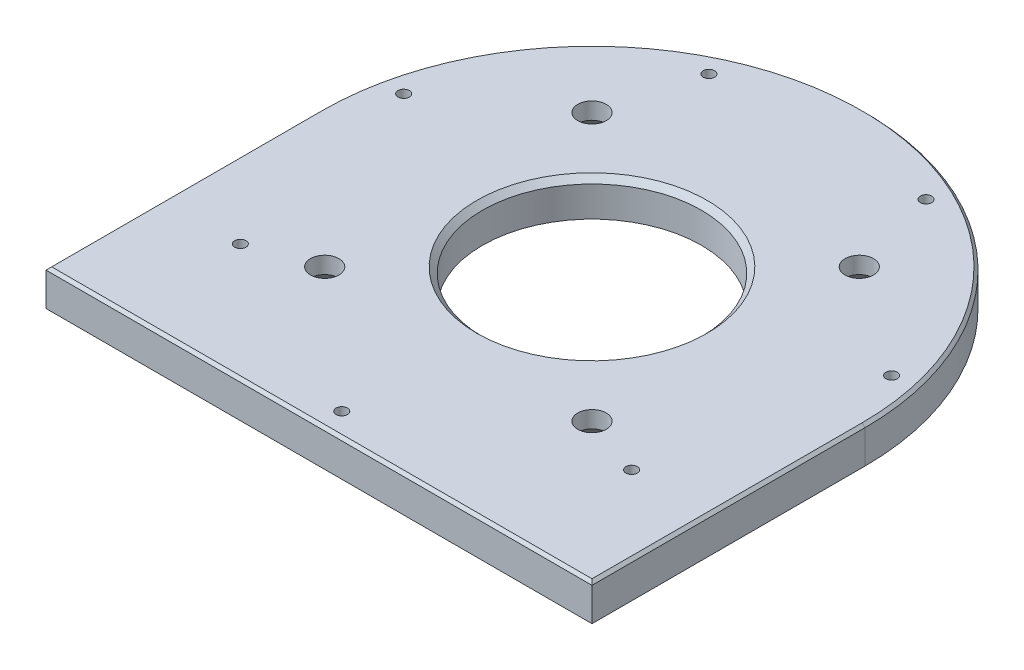
ISO-10303-21;
HEADER;
FILE_DESCRIPTION(('STEP AP214'),'2;1');
FILE_NAME('part.step','',(''),(''),'','','');
FILE_SCHEMA(('AUTOMOTIVE_DESIGN { 1 0 10303 214 1 1 1 1 }'));
ENDSEC;
DATA;
#1=APPLICATION_CONTEXT('core data for automotive mechanical design processes');
#2=APPLICATION_PROTOCOL_DEFINITION('international standard','automotive_design',2000,#1);
#3=PRODUCT_CONTEXT('',#1,'mechanical');
#4=PRODUCT('Part','Part','',(#3));
#5=PRODUCT_RELATED_PRODUCT_CATEGORY('part','',(#4));
#6=PRODUCT_DEFINITION_FORMATION('','',#4);
#7=PRODUCT_DEFINITION_CONTEXT('part definition',#1,'design');
#8=PRODUCT_DEFINITION('design','',#6,#7);
#9=PRODUCT_DEFINITION_SHAPE('','',#8);
#10=(LENGTH_UNIT() NAMED_UNIT(*) SI_UNIT(.MILLI.,.METRE.));
#11=(NAMED_UNIT(*) PLANE_ANGLE_UNIT() SI_UNIT($,.RADIAN.));
#12=(NAMED_UNIT(*) SI_UNIT($,.STERADIAN.) SOLID_ANGLE_UNIT());
#13=UNCERTAINTY_MEASURE_WITH_UNIT(LENGTH_MEASURE(1.E-05),#10,'distance_accuracy_value','');
#14=(GEOMETRIC_REPRESENTATION_CONTEXT(3) GLOBAL_UNCERTAINTY_ASSIGNED_CONTEXT((#13)) GLOBAL_UNIT_ASSIGNED_CONTEXT((#10,
#11,#12)) REPRESENTATION_CONTEXT('',''));
#15=CARTESIAN_POINT('',(0.,0.,0.));
#16=DIRECTION('',(0.,0.,1.));
#17=DIRECTION('',(1.,0.,0.));
#18=AXIS2_PLACEMENT_3D('',#15,#16,#17);
#19=CARTESIAN_POINT('',(-48.,6.35,0.));
#20=DIRECTION('',(1.,0.,0.));
#21=DIRECTION('',(0.,0.,-1.));
#22=AXIS2_PLACEMENT_3D('',#19,#20,#21);
#23=PLANE('',#22);
#24=DIRECTION('',(0.,-1.,0.));
#25=VECTOR('',#24,1.);
#26=CARTESIAN_POINT('',(-48.,6.35,48.));
#27=LINE('',#26,#25);
#28=CARTESIAN_POINT('',(-48.,5.85,48.));
#29=VERTEX_POINT('',#28);
#30=CARTESIAN_POINT('',(-48.,0.,48.));
#31=VERTEX_POINT('',#30);
#32=EDGE_CURVE('E124',#29,#31,#27,.T.);
#33=ORIENTED_EDGE('',*,*,#32,.F.);
#34=DIRECTION('',(0.,0.,-1.));
#35=VECTOR('',#34,1.);
#36=CARTESIAN_POINT('',(-48.,5.85,0.));
#37=LINE('',#36,#35);
#38=CARTESIAN_POINT('',(-48.,5.85,0.));
#39=VERTEX_POINT('',#38);
#40=EDGE_CURVE('E137',#29,#39,#37,.T.);
#41=ORIENTED_EDGE('',*,*,#40,.T.);
#42=DIRECTION('',(0.,-1.,0.));
#43=VECTOR('',#42,1.);
#44=CARTESIAN_POINT('',(-48.,6.35,0.));
#45=LINE('',#44,#43);
#46=CARTESIAN_POINT('',(-48.,0.,0.));
#47=VERTEX_POINT('',#46);
#48=EDGE_CURVE('E126',#39,#47,#45,.T.);
#49=ORIENTED_EDGE('',*,*,#48,.T.);
#50=DIRECTION('',(0.,0.,1.));
#51=VECTOR('',#50,1.);
#52=CARTESIAN_POINT('',(-48.,0.,0.));
#53=LINE('',#52,#51);
#54=EDGE_CURVE('E113',#47,#31,#53,.T.);
#55=ORIENTED_EDGE('',*,*,#54,.T.);
#56=EDGE_LOOP('',(#33,#41,#49,#55));
#57=FACE_BOUND('',#56,.T.);
#58=ADVANCED_FACE('F41',(#57),#23,.F.);
#59=CARTESIAN_POINT('',(-48.,6.35,48.));
#60=DIRECTION('',(0.,0.,-1.));
#61=DIRECTION('',(-1.,0.,0.));
#62=AXIS2_PLACEMENT_3D('',#59,#60,#61);
#63=PLANE('',#62);
#64=DIRECTION('',(0.,-1.,0.));
#65=VECTOR('',#64,1.);
#66=CARTESIAN_POINT('',(48.,6.35,48.));
#67=LINE('',#66,#65);
#68=CARTESIAN_POINT('',(48.,5.85,48.));
#69=VERTEX_POINT('',#68);
#70=CARTESIAN_POINT('',(48.,0.,48.));
#71=VERTEX_POINT('',#70);
#72=EDGE_CURVE('E100',#69,#71,#67,.T.);
#73=ORIENTED_EDGE('',*,*,#72,.F.);
#74=DIRECTION('',(-1.,0.,0.));
#75=VECTOR('',#74,1.);
#76=CARTESIAN_POINT('',(-48.,5.85,48.));
#77=LINE('',#76,#75);
#78=EDGE_CURVE('E142',#69,#29,#77,.T.);
#79=ORIENTED_EDGE('',*,*,#78,.T.);
#80=ORIENTED_EDGE('',*,*,#32,.T.);
#81=DIRECTION('',(1.,0.,0.));
#82=VECTOR('',#81,1.);
#83=CARTESIAN_POINT('',(-48.,0.,48.));
#84=LINE('',#83,#82);
#85=EDGE_CURVE('E108',#31,#71,#84,.T.);
#86=ORIENTED_EDGE('',*,*,#85,.T.);
#87=EDGE_LOOP('',(#73,#79,#80,#86));
#88=FACE_BOUND('',#87,.T.);
#89=ADVANCED_FACE('F292',(#88),#63,.F.);
#90=CARTESIAN_POINT('',(48.,6.35,48.));
#91=DIRECTION('',(-1.,0.,0.));
#92=DIRECTION('',(0.,0.,1.));
#93=AXIS2_PLACEMENT_3D('',#90,#91,#92);
#94=PLANE('',#93);
#95=DIRECTION('',(0.,-1.,0.));
#96=VECTOR('',#95,1.);
#97=CARTESIAN_POINT('',(48.,6.35,0.));
#98=LINE('',#97,#96);
#99=CARTESIAN_POINT('',(48.,5.85,0.));
#100=VERTEX_POINT('',#99);
#101=CARTESIAN_POINT('',(48.,0.,0.));
#102=VERTEX_POINT('',#101);
#103=EDGE_CURVE('E94',#100,#102,#98,.T.);
#104=ORIENTED_EDGE('',*,*,#103,.F.);
#105=DIRECTION('',(0.,0.,1.));
#106=VECTOR('',#105,1.);
#107=CARTESIAN_POINT('',(48.,5.85,48.));
#108=LINE('',#107,#106);
#109=EDGE_CURVE('E57',#100,#69,#108,.T.);
#110=ORIENTED_EDGE('',*,*,#109,.T.);
#111=ORIENTED_EDGE('',*,*,#72,.T.);
#112=DIRECTION('',(0.,0.,-1.));
#113=VECTOR('',#112,1.);
#114=CARTESIAN_POINT('',(48.,0.,48.));
#115=LINE('',#114,#113);
#116=EDGE_CURVE('E101',#71,#102,#115,.T.);
#117=ORIENTED_EDGE('',*,*,#116,.T.);
#118=EDGE_LOOP('',(#104,#110,#111,#117));
#119=FACE_BOUND('',#118,.T.);
#120=ADVANCED_FACE('F104',(#119),#94,.F.);
#121=CARTESIAN_POINT('',(0.,6.35,0.));
#122=DIRECTION('',(0.,1.,0.));
#123=DIRECTION('',(0.,0.,1.));
#124=AXIS2_PLACEMENT_3D('',#121,#122,#123);
#125=PLANE('',#124);
#126=CARTESIAN_POINT('',(0.,6.35,0.));
#127=DIRECTION('',(0.,1.,0.));
#128=DIRECTION('',(0.,0.,1.));
#129=AXIS2_PLACEMENT_3D('',#126,#127,#128);
#130=CIRCLE('',#129,20.25);
#131=CARTESIAN_POINT('',(0.,6.35,20.25));
#132=VERTEX_POINT('',#131);
#133=EDGE_CURVE('E158',#132,#132,#130,.F.);
#134=ORIENTED_EDGE('',*,*,#133,.T.);
#135=EDGE_LOOP('',(#134));
#136=FACE_BOUND('',#135,.T.);
#137=CARTESIAN_POINT('',(0.,6.35,0.));
#138=DIRECTION('',(0.,1.,0.));
#139=DIRECTION('',(0.,0.,1.));
#140=AXIS2_PLACEMENT_3D('',#137,#138,#139);
#141=CIRCLE('',#140,47.5);
#142=CARTESIAN_POINT('',(47.5,6.35,0.));
#143=VERTEX_POINT('',#142);
#144=CARTESIAN_POINT('',(-47.5,6.35,0.));
#145=VERTEX_POINT('',#144);
#146=EDGE_CURVE('E132',#143,#145,#141,.T.);
#147=ORIENTED_EDGE('',*,*,#146,.T.);
#148=DIRECTION('',(0.,0.,1.));
#149=VECTOR('',#148,1.);
#150=CARTESIAN_POINT('',(-47.5,6.35,48.));
#151=LINE('',#150,#149);
#152=CARTESIAN_POINT('',(-47.5,6.35,47.5));
#153=VERTEX_POINT('',#152);
#154=EDGE_CURVE('E134',#145,#153,#151,.T.);
#155=ORIENTED_EDGE('',*,*,#154,.T.);
#156=DIRECTION('',(1.,0.,0.));
#157=VECTOR('',#156,1.);
#158=CARTESIAN_POINT('',(48.,6.35,47.5));
#159=LINE('',#158,#157);
#160=CARTESIAN_POINT('',(47.5,6.35,47.5));
#161=VERTEX_POINT('',#160);
#162=EDGE_CURVE('E128',#153,#161,#159,.T.);
#163=ORIENTED_EDGE('',*,*,#162,.T.);
#164=DIRECTION('',(0.,0.,-1.));
#165=VECTOR('',#164,1.);
#166=CARTESIAN_POINT('',(47.5,6.35,0.));
#167=LINE('',#166,#165);
#168=EDGE_CURVE('E130',#161,#143,#167,.T.);
#169=ORIENTED_EDGE('',*,*,#168,.T.);
#170=EDGE_LOOP('',(#147,#155,#163,#169));
#171=FACE_BOUND('',#170,.T.);
#172=CARTESIAN_POINT('',(-23.5,6.35,23.5));
#173=DIRECTION('',(0.,1.,0.));
#174=DIRECTION('',(0.,0.,1.));
#175=AXIS2_PLACEMENT_3D('',#172,#173,#174);
#176=CIRCLE('',#175,2.49999999999999);
#177=CARTESIAN_POINT('',(-23.5,6.35,26.));
#178=VERTEX_POINT('',#177);
#179=EDGE_CURVE('E221',#178,#178,#176,.T.);
#180=ORIENTED_EDGE('',*,*,#179,.F.);
#181=EDGE_LOOP('',(#180));
#182=FACE_BOUND('',#181,.T.);
#183=CARTESIAN_POINT('',(0.,6.35,44.));
#184=DIRECTION('',(0.,1.,0.));
#185=DIRECTION('',(0.,0.,1.));
#186=AXIS2_PLACEMENT_3D('',#183,#184,#185);
#187=CIRCLE('',#186,1.);
#188=CARTESIAN_POINT('',(0.,6.35,45.));
#189=VERTEX_POINT('',#188);
#190=EDGE_CURVE('E226',#189,#189,#187,.T.);
#191=ORIENTED_EDGE('',*,*,#190,.F.);
#192=EDGE_LOOP('',(#191));
#193=FACE_BOUND('',#192,.T.);
#194=CARTESIAN_POINT('',(34.4005852285933,6.35,27.4335512817843));
#195=DIRECTION('',(0.,1.,0.));
#196=DIRECTION('',(0.,0.,1.));
#197=AXIS2_PLACEMENT_3D('',#194,#195,#196);
#198=CIRCLE('',#197,0.999999999999998);
#199=CARTESIAN_POINT('',(34.4005852285933,6.35,28.4335512817843));
#200=VERTEX_POINT('',#199);
#201=EDGE_CURVE('E213',#200,#200,#198,.T.);
#202=ORIENTED_EDGE('',*,*,#201,.F.);
#203=EDGE_LOOP('',(#202));
#204=FACE_BOUND('',#203,.T.);
#205=CARTESIAN_POINT('',(-34.4005852285933,6.35,27.4335512817843));
#206=DIRECTION('',(0.,1.,0.));
#207=DIRECTION('',(0.,0.,1.));
#208=AXIS2_PLACEMENT_3D('',#205,#206,#207);
#209=CIRCLE('',#208,0.999999999999998);
#210=CARTESIAN_POINT('',(-34.4005852285933,6.35,28.4335512817843));
#211=VERTEX_POINT('',#210);
#212=EDGE_CURVE('E155',#211,#211,#209,.T.);
#213=ORIENTED_EDGE('',*,*,#212,.F.);
#214=EDGE_LOOP('',(#213));
#215=FACE_BOUND('',#214,.T.);
#216=CARTESIAN_POINT('',(23.5,6.35,23.5));
#217=DIRECTION('',(0.,1.,0.));
#218=DIRECTION('',(0.,0.,1.));
#219=AXIS2_PLACEMENT_3D('',#216,#217,#218);
#220=CIRCLE('',#219,2.5);
#221=CARTESIAN_POINT('',(23.5,6.35,26.));
#222=VERTEX_POINT('',#221);
#223=EDGE_CURVE('E224',#222,#222,#220,.T.);
#224=ORIENTED_EDGE('',*,*,#223,.F.);
#225=EDGE_LOOP('',(#224));
#226=FACE_BOUND('',#225,.T.);
#227=CARTESIAN_POINT('',(42.8968281360002,6.35,-9.79092109407785));
#228=DIRECTION('',(0.,1.,0.));
#229=DIRECTION('',(0.,0.,1.));
#230=AXIS2_PLACEMENT_3D('',#227,#228,#229);
#231=CIRCLE('',#230,0.999999999999998);
#232=CARTESIAN_POINT('',(42.8968281360002,6.35,-8.79092109407785));
#233=VERTEX_POINT('',#232);
#234=EDGE_CURVE('E233',#233,#233,#231,.T.);
#235=ORIENTED_EDGE('',*,*,#234,.F.);
#236=EDGE_LOOP('',(#235));
#237=FACE_BOUND('',#236,.T.);
#238=CARTESIAN_POINT('',(-19.0908845211726,6.35,-39.6426301877064));
#239=DIRECTION('',(0.,1.,0.));
#240=DIRECTION('',(0.,0.,1.));
#241=AXIS2_PLACEMENT_3D('',#238,#239,#240);
#242=CIRCLE('',#241,1.);
#243=CARTESIAN_POINT('',(-19.0908845211726,6.35,-38.6426301877064));
#244=VERTEX_POINT('',#243);
#245=EDGE_CURVE('E245',#244,#244,#242,.T.);
#246=ORIENTED_EDGE('',*,*,#245,.F.);
#247=EDGE_LOOP('',(#246));
#248=FACE_BOUND('',#247,.T.);
#249=CARTESIAN_POINT('',(23.5,6.35,-23.5));
#250=DIRECTION('',(0.,1.,0.));
#251=DIRECTION('',(0.,0.,1.));
#252=AXIS2_PLACEMENT_3D('',#249,#250,#251);
#253=CIRCLE('',#252,2.5);
#254=CARTESIAN_POINT('',(23.5,6.35,-21.));
#255=VERTEX_POINT('',#254);
#256=EDGE_CURVE('E114',#255,#255,#253,.T.);
#257=ORIENTED_EDGE('',*,*,#256,.F.);
#258=EDGE_LOOP('',(#257));
#259=FACE_BOUND('',#258,.T.);
#260=CARTESIAN_POINT('',(-23.4999999999999,6.35,-23.5000000000001));
#261=DIRECTION('',(0.,1.,0.));
#262=DIRECTION('',(0.,0.,1.));
#263=AXIS2_PLACEMENT_3D('',#260,#261,#262);
#264=CIRCLE('',#263,2.50000000000001);
#265=CARTESIAN_POINT('',(-23.4999999999999,6.35,-21.));
#266=VERTEX_POINT('',#265);
#267=EDGE_CURVE('E118',#266,#266,#264,.T.);
#268=ORIENTED_EDGE('',*,*,#267,.F.);
#269=EDGE_LOOP('',(#268));
#270=FACE_BOUND('',#269,.T.);
#271=CARTESIAN_POINT('',(-42.8968281360002,6.35,-9.79092109407783));
#272=DIRECTION('',(0.,1.,0.));
#273=DIRECTION('',(0.,0.,1.));
#274=AXIS2_PLACEMENT_3D('',#271,#272,#273);
#275=CIRCLE('',#274,0.999999999999998);
#276=CARTESIAN_POINT('',(-42.8968281360002,6.35,-8.79092109407783));
#277=VERTEX_POINT('',#276);
#278=EDGE_CURVE('E251',#277,#277,#275,.T.);
#279=ORIENTED_EDGE('',*,*,#278,.F.);
#280=EDGE_LOOP('',(#279));
#281=FACE_BOUND('',#280,.T.);
#282=CARTESIAN_POINT('',(19.0908845211725,6.35,-39.6426301877064));
#283=DIRECTION('',(0.,1.,0.));
#284=DIRECTION('',(0.,0.,1.));
#285=AXIS2_PLACEMENT_3D('',#282,#283,#284);
#286=CIRCLE('',#285,1.);
#287=CARTESIAN_POINT('',(19.0908845211725,6.35,-38.6426301877064));
#288=VERTEX_POINT('',#287);
#289=EDGE_CURVE('E239',#288,#288,#286,.T.);
#290=ORIENTED_EDGE('',*,*,#289,.F.);
#291=EDGE_LOOP('',(#290));
#292=FACE_BOUND('',#291,.T.);
#293=ADVANCED_FACE('F192',(#136,#171,#182,#193,#204,#215,#226,#237,#248,#259,#270,#281,#292),
#125,.T.);
#294=CARTESIAN_POINT('',(0.,0.,0.));
#295=DIRECTION('',(0.,1.,0.));
#296=DIRECTION('',(0.,0.,1.));
#297=AXIS2_PLACEMENT_3D('',#294,#295,#296);
#298=PLANE('',#297);
#299=CARTESIAN_POINT('',(23.5,0.,23.5));
#300=DIRECTION('',(0.,1.,0.));
#301=DIRECTION('',(0.,0.,1.));
#302=AXIS2_PLACEMENT_3D('',#299,#300,#301);
#303=CIRCLE('',#302,5.90000000000002);
#304=CARTESIAN_POINT('',(23.5,0.,29.4000000000001));
#305=VERTEX_POINT('',#304);
#306=EDGE_CURVE('E170',#305,#305,#303,.T.);
#307=ORIENTED_EDGE('',*,*,#306,.T.);
#308=EDGE_LOOP('',(#307));
#309=FACE_BOUND('',#308,.T.);
#310=CARTESIAN_POINT('',(23.5,0.,-23.5));
#311=DIRECTION('',(0.,1.,0.));
#312=DIRECTION('',(0.,0.,1.));
#313=AXIS2_PLACEMENT_3D('',#310,#311,#312);
#314=CIRCLE('',#313,5.90000000000002);
#315=CARTESIAN_POINT('',(23.5,0.,-17.5999999999999));
#316=VERTEX_POINT('',#315);
#317=EDGE_CURVE('E167',#316,#316,#314,.T.);
#318=ORIENTED_EDGE('',*,*,#317,.T.);
#319=EDGE_LOOP('',(#318));
#320=FACE_BOUND('',#319,.T.);
#321=CARTESIAN_POINT('',(-23.4999999999999,0.,-23.5000000000001));
#322=DIRECTION('',(0.,1.,0.));
#323=DIRECTION('',(0.,0.,1.));
#324=AXIS2_PLACEMENT_3D('',#321,#322,#323);
#325=CIRCLE('',#324,5.90000000000002);
#326=CARTESIAN_POINT('',(-23.4999999999999,0.,-17.6));
#327=VERTEX_POINT('',#326);
#328=EDGE_CURVE('E164',#327,#327,#325,.T.);
#329=ORIENTED_EDGE('',*,*,#328,.T.);
#330=EDGE_LOOP('',(#329));
#331=FACE_BOUND('',#330,.T.);
#332=CARTESIAN_POINT('',(-23.5,0.,23.5));
#333=DIRECTION('',(0.,1.,0.));
#334=DIRECTION('',(0.,0.,1.));
#335=AXIS2_PLACEMENT_3D('',#332,#333,#334);
#336=CIRCLE('',#335,5.89999999999997);
#337=CARTESIAN_POINT('',(-23.5,0.,17.6));
#338=VERTEX_POINT('',#337);
#339=EDGE_CURVE('E161',#338,#338,#336,.T.);
#340=ORIENTED_EDGE('',*,*,#339,.T.);
#341=EDGE_LOOP('',(#340));
#342=FACE_BOUND('',#341,.T.);
#343=CARTESIAN_POINT('',(0.,0.,0.));
#344=DIRECTION('',(0.,1.,0.));
#345=DIRECTION('',(0.,0.,1.));
#346=AXIS2_PLACEMENT_3D('',#343,#344,#345);
#347=CIRCLE('',#346,19.25);
#348=CARTESIAN_POINT('',(0.,0.,19.25));
#349=VERTEX_POINT('',#348);
#350=EDGE_CURVE('E200',#349,#349,#347,.T.);
#351=ORIENTED_EDGE('',*,*,#350,.T.);
#352=EDGE_LOOP('',(#351));
#353=FACE_BOUND('',#352,.T.);
#354=CARTESIAN_POINT('',(0.,0.,44.));
#355=DIRECTION('',(0.,1.,0.));
#356=DIRECTION('',(0.,0.,1.));
#357=AXIS2_PLACEMENT_3D('',#354,#355,#356);
#358=CIRCLE('',#357,1.);
#359=CARTESIAN_POINT('',(0.,0.,45.));
#360=VERTEX_POINT('',#359);
#361=EDGE_CURVE('E204',#360,#360,#358,.T.);
#362=ORIENTED_EDGE('',*,*,#361,.T.);
#363=EDGE_LOOP('',(#362));
#364=FACE_BOUND('',#363,.T.);
#365=CARTESIAN_POINT('',(34.4005852285933,0.,27.4335512817843));
#366=DIRECTION('',(0.,1.,0.));
#367=DIRECTION('',(0.,0.,1.));
#368=AXIS2_PLACEMENT_3D('',#365,#366,#367);
#369=CIRCLE('',#368,0.999999999999998);
#370=CARTESIAN_POINT('',(34.4005852285933,0.,28.4335512817843));
#371=VERTEX_POINT('',#370);
#372=EDGE_CURVE('E208',#371,#371,#369,.T.);
#373=ORIENTED_EDGE('',*,*,#372,.T.);
#374=EDGE_LOOP('',(#373));
#375=FACE_BOUND('',#374,.T.);
#376=CARTESIAN_POINT('',(-34.4005852285933,0.,27.4335512817843));
#377=DIRECTION('',(0.,1.,0.));
#378=DIRECTION('',(0.,0.,1.));
#379=AXIS2_PLACEMENT_3D('',#376,#377,#378);
#380=CIRCLE('',#379,0.999999999999998);
#381=CARTESIAN_POINT('',(-34.4005852285933,0.,28.4335512817843));
#382=VERTEX_POINT('',#381);
#383=EDGE_CURVE('E211',#382,#382,#380,.T.);
#384=ORIENTED_EDGE('',*,*,#383,.T.);
#385=EDGE_LOOP('',(#384));
#386=FACE_BOUND('',#385,.T.);
#387=ORIENTED_EDGE('',*,*,#116,.F.);
#388=ORIENTED_EDGE('',*,*,#85,.F.);
#389=ORIENTED_EDGE('',*,*,#54,.F.);
#390=CARTESIAN_POINT('',(0.,0.,0.));
#391=DIRECTION('',(0.,1.,0.));
#392=DIRECTION('',(0.,0.,1.));
#393=AXIS2_PLACEMENT_3D('',#390,#391,#392);
#394=CIRCLE('',#393,48.);
#395=EDGE_CURVE('E98',#102,#47,#394,.T.);
#396=ORIENTED_EDGE('',*,*,#395,.F.);
#397=EDGE_LOOP('',(#387,#388,#389,#396));
#398=FACE_BOUND('',#397,.T.);
#399=CARTESIAN_POINT('',(42.8968281360002,0.,-9.79092109407785));
#400=DIRECTION('',(0.,1.,0.));
#401=DIRECTION('',(0.,0.,1.));
#402=AXIS2_PLACEMENT_3D('',#399,#400,#401);
#403=CIRCLE('',#402,0.999999999999998);
#404=CARTESIAN_POINT('',(42.8968281360002,0.,-8.79092109407785));
#405=VERTEX_POINT('',#404);
#406=EDGE_CURVE('E232',#405,#405,#403,.T.);
#407=ORIENTED_EDGE('',*,*,#406,.T.);
#408=EDGE_LOOP('',(#407));
#409=FACE_BOUND('',#408,.T.);
#410=CARTESIAN_POINT('',(19.0908845211725,0.,-39.6426301877064));
#411=DIRECTION('',(0.,1.,0.));
#412=DIRECTION('',(0.,0.,1.));
#413=AXIS2_PLACEMENT_3D('',#410,#411,#412);
#414=CIRCLE('',#413,1.);
#415=CARTESIAN_POINT('',(19.0908845211725,0.,-38.6426301877064));
#416=VERTEX_POINT('',#415);
#417=EDGE_CURVE('E236',#416,#416,#414,.T.);
#418=ORIENTED_EDGE('',*,*,#417,.T.);
#419=EDGE_LOOP('',(#418));
#420=FACE_BOUND('',#419,.T.);
#421=CARTESIAN_POINT('',(-19.0908845211726,0.,-39.6426301877064));
#422=DIRECTION('',(0.,1.,0.));
#423=DIRECTION('',(0.,0.,1.));
#424=AXIS2_PLACEMENT_3D('',#421,#422,#423);
#425=CIRCLE('',#424,1.);
#426=CARTESIAN_POINT('',(-19.0908845211726,0.,-38.6426301877064));
#427=VERTEX_POINT('',#426);
#428=EDGE_CURVE('E242',#427,#427,#425,.T.);
#429=ORIENTED_EDGE('',*,*,#428,.T.);
#430=EDGE_LOOP('',(#429));
#431=FACE_BOUND('',#430,.T.);
#432=CARTESIAN_POINT('',(-42.8968281360002,0.,-9.79092109407783));
#433=DIRECTION('',(0.,1.,0.));
#434=DIRECTION('',(0.,0.,1.));
#435=AXIS2_PLACEMENT_3D('',#432,#433,#434);
#436=CIRCLE('',#435,0.999999999999998);
#437=CARTESIAN_POINT('',(-42.8968281360002,0.,-8.79092109407783));
#438=VERTEX_POINT('',#437);
#439=EDGE_CURVE('E248',#438,#438,#436,.T.);
#440=ORIENTED_EDGE('',*,*,#439,.T.);
#441=EDGE_LOOP('',(#440));
#442=FACE_BOUND('',#441,.T.);
#443=ADVANCED_FACE('F110',(#309,#320,#331,#342,#353,#364,#375,#386,#398,#409,#420,#431,#442),
#298,.F.);
#444=CARTESIAN_POINT('',(0.,6.35,0.));
#445=DIRECTION('',(0.,-1.,0.));
#446=DIRECTION('',(0.,0.,-1.));
#447=AXIS2_PLACEMENT_3D('',#444,#445,#446);
#448=CYLINDRICAL_SURFACE('',#447,48.);
#449=ORIENTED_EDGE('',*,*,#48,.F.);
#450=CARTESIAN_POINT('',(0.,5.85,0.));
#451=DIRECTION('',(0.,1.,0.));
#452=DIRECTION('',(0.,0.,1.));
#453=AXIS2_PLACEMENT_3D('',#450,#451,#452);
#454=CIRCLE('',#453,48.);
#455=EDGE_CURVE('E65',#39,#100,#454,.F.);
#456=ORIENTED_EDGE('',*,*,#455,.T.);
#457=ORIENTED_EDGE('',*,*,#103,.T.);
#458=ORIENTED_EDGE('',*,*,#395,.T.);
#459=EDGE_LOOP('',(#449,#456,#457,#458));
#460=FACE_BOUND('',#459,.T.);
#461=ADVANCED_FACE('F96',(#460),#448,.T.);
#462=CARTESIAN_POINT('',(0.,6.35,0.));
#463=DIRECTION('',(0.,-1.,0.));
#464=DIRECTION('',(0.,0.,-1.));
#465=AXIS2_PLACEMENT_3D('',#462,#463,#464);
#466=CYLINDRICAL_SURFACE('',#465,19.25);
#467=CARTESIAN_POINT('',(0.,5.34999999999997,0.));
#468=DIRECTION('',(0.,1.,0.));
#469=DIRECTION('',(0.,0.,1.));
#470=AXIS2_PLACEMENT_3D('',#467,#468,#469);
#471=CIRCLE('',#470,19.25);
#472=CARTESIAN_POINT('',(0.,5.34999999999997,19.25));
#473=VERTEX_POINT('',#472);
#474=EDGE_CURVE('E144',#473,#473,#471,.T.);
#475=ORIENTED_EDGE('',*,*,#474,.T.);
#476=EDGE_LOOP('',(#475));
#477=FACE_BOUND('',#476,.T.);
#478=ORIENTED_EDGE('',*,*,#350,.F.);
#479=EDGE_LOOP('',(#478));
#480=FACE_BOUND('',#479,.T.);
#481=ADVANCED_FACE('F366',(#477,#480),#466,.F.);
#482=CARTESIAN_POINT('',(23.5,6.35,-23.5));
#483=DIRECTION('',(0.,-1.,0.));
#484=DIRECTION('',(0.,0.,-1.));
#485=AXIS2_PLACEMENT_3D('',#482,#483,#484);
#486=CYLINDRICAL_SURFACE('',#485,2.5);
#487=CARTESIAN_POINT('',(23.5,3.40000000000002,-23.5));
#488=DIRECTION('',(0.,1.,0.));
#489=DIRECTION('',(0.,0.,1.));
#490=AXIS2_PLACEMENT_3D('',#487,#488,#489);
#491=CIRCLE('',#490,2.5);
#492=CARTESIAN_POINT('',(23.5,3.40000000000002,-21.));
#493=VERTEX_POINT('',#492);
#494=EDGE_CURVE('E176',#493,#493,#491,.F.);
#495=ORIENTED_EDGE('',*,*,#494,.T.);
#496=EDGE_LOOP('',(#495));
#497=FACE_BOUND('',#496,.T.);
#498=ORIENTED_EDGE('',*,*,#256,.T.);
#499=EDGE_LOOP('',(#498));
#500=FACE_BOUND('',#499,.T.);
#501=ADVANCED_FACE('F289',(#497,#500),#486,.F.);
#502=CARTESIAN_POINT('',(-23.4999999999999,6.35,-23.5000000000001));
#503=DIRECTION('',(0.,-1.,0.));
#504=DIRECTION('',(0.,0.,-1.));
#505=AXIS2_PLACEMENT_3D('',#502,#503,#504);
#506=CYLINDRICAL_SURFACE('',#505,2.50000000000001);
#507=CARTESIAN_POINT('',(-23.4999999999999,3.40000000000002,-23.5000000000001));
#508=DIRECTION('',(0.,1.,0.));
#509=DIRECTION('',(0.,0.,1.));
#510=AXIS2_PLACEMENT_3D('',#507,#508,#509);
#511=CIRCLE('',#510,2.50000000000001);
#512=CARTESIAN_POINT('',(-23.4999999999999,3.40000000000002,-21.));
#513=VERTEX_POINT('',#512);
#514=EDGE_CURVE('E50',#513,#513,#511,.F.);
#515=ORIENTED_EDGE('',*,*,#514,.T.);
#516=EDGE_LOOP('',(#515));
#517=FACE_BOUND('',#516,.T.);
#518=ORIENTED_EDGE('',*,*,#267,.T.);
#519=EDGE_LOOP('',(#518));
#520=FACE_BOUND('',#519,.T.);
#521=ADVANCED_FACE('F181',(#517,#520),#506,.F.);
#522=CARTESIAN_POINT('',(-42.8968281360002,6.35,-9.79092109407783));
#523=DIRECTION('',(0.,-1.,0.));
#524=DIRECTION('',(0.,0.,-1.));
#525=AXIS2_PLACEMENT_3D('',#522,#523,#524);
#526=CYLINDRICAL_SURFACE('',#525,0.999999999999998);
#527=ORIENTED_EDGE('',*,*,#278,.T.);
#528=EDGE_LOOP('',(#527));
#529=FACE_BOUND('',#528,.T.);
#530=ORIENTED_EDGE('',*,*,#439,.F.);
#531=EDGE_LOOP('',(#530));
#532=FACE_BOUND('',#531,.T.);
#533=ADVANCED_FACE('F279',(#529,#532),#526,.F.);
#534=CARTESIAN_POINT('',(-19.0908845211726,6.35,-39.6426301877064));
#535=DIRECTION('',(0.,-1.,0.));
#536=DIRECTION('',(0.,0.,-1.));
#537=AXIS2_PLACEMENT_3D('',#534,#535,#536);
#538=CYLINDRICAL_SURFACE('',#537,1.);
#539=ORIENTED_EDGE('',*,*,#245,.T.);
#540=EDGE_LOOP('',(#539));
#541=FACE_BOUND('',#540,.T.);
#542=ORIENTED_EDGE('',*,*,#428,.F.);
#543=EDGE_LOOP('',(#542));
#544=FACE_BOUND('',#543,.T.);
#545=ADVANCED_FACE('F270',(#541,#544),#538,.F.);
#546=CARTESIAN_POINT('',(19.0908845211725,6.35,-39.6426301877064));
#547=DIRECTION('',(0.,-1.,0.));
#548=DIRECTION('',(0.,0.,-1.));
#549=AXIS2_PLACEMENT_3D('',#546,#547,#548);
#550=CYLINDRICAL_SURFACE('',#549,1.);
#551=ORIENTED_EDGE('',*,*,#289,.T.);
#552=EDGE_LOOP('',(#551));
#553=FACE_BOUND('',#552,.T.);
#554=ORIENTED_EDGE('',*,*,#417,.F.);
#555=EDGE_LOOP('',(#554));
#556=FACE_BOUND('',#555,.T.);
#557=ADVANCED_FACE('F266',(#553,#556),#550,.F.);
#558=CARTESIAN_POINT('',(42.8968281360002,6.35,-9.79092109407785));
#559=DIRECTION('',(0.,-1.,0.));
#560=DIRECTION('',(0.,0.,-1.));
#561=AXIS2_PLACEMENT_3D('',#558,#559,#560);
#562=CYLINDRICAL_SURFACE('',#561,0.999999999999998);
#563=ORIENTED_EDGE('',*,*,#234,.T.);
#564=EDGE_LOOP('',(#563));
#565=FACE_BOUND('',#564,.T.);
#566=ORIENTED_EDGE('',*,*,#406,.F.);
#567=EDGE_LOOP('',(#566));
#568=FACE_BOUND('',#567,.T.);
#569=ADVANCED_FACE('F269',(#565,#568),#562,.F.);
#570=CARTESIAN_POINT('',(23.5,6.35,23.5));
#571=DIRECTION('',(0.,-1.,0.));
#572=DIRECTION('',(0.,0.,-1.));
#573=AXIS2_PLACEMENT_3D('',#570,#571,#572);
#574=CYLINDRICAL_SURFACE('',#573,2.5);
#575=CARTESIAN_POINT('',(23.5,3.40000000000002,23.5));
#576=DIRECTION('',(0.,1.,0.));
#577=DIRECTION('',(0.,0.,1.));
#578=AXIS2_PLACEMENT_3D('',#575,#576,#577);
#579=CIRCLE('',#578,2.5);
#580=CARTESIAN_POINT('',(23.5,3.40000000000002,26.));
#581=VERTEX_POINT('',#580);
#582=EDGE_CURVE('E173',#581,#581,#579,.F.);
#583=ORIENTED_EDGE('',*,*,#582,.T.);
#584=EDGE_LOOP('',(#583));
#585=FACE_BOUND('',#584,.T.);
#586=ORIENTED_EDGE('',*,*,#223,.T.);
#587=EDGE_LOOP('',(#586));
#588=FACE_BOUND('',#587,.T.);
#589=ADVANCED_FACE('F483',(#585,#588),#574,.F.);
#590=CARTESIAN_POINT('',(-34.4005852285933,6.35,27.4335512817843));
#591=DIRECTION('',(0.,-1.,0.));
#592=DIRECTION('',(0.,0.,-1.));
#593=AXIS2_PLACEMENT_3D('',#590,#591,#592);
#594=CYLINDRICAL_SURFACE('',#593,0.999999999999998);
#595=ORIENTED_EDGE('',*,*,#212,.T.);
#596=EDGE_LOOP('',(#595));
#597=FACE_BOUND('',#596,.T.);
#598=ORIENTED_EDGE('',*,*,#383,.F.);
#599=EDGE_LOOP('',(#598));
#600=FACE_BOUND('',#599,.T.);
#601=ADVANCED_FACE('F491',(#597,#600),#594,.F.);
#602=CARTESIAN_POINT('',(34.4005852285933,6.35,27.4335512817843));
#603=DIRECTION('',(0.,-1.,0.));
#604=DIRECTION('',(0.,0.,-1.));
#605=AXIS2_PLACEMENT_3D('',#602,#603,#604);
#606=CYLINDRICAL_SURFACE('',#605,0.999999999999998);
#607=ORIENTED_EDGE('',*,*,#201,.T.);
#608=EDGE_LOOP('',(#607));
#609=FACE_BOUND('',#608,.T.);
#610=ORIENTED_EDGE('',*,*,#372,.F.);
#611=EDGE_LOOP('',(#610));
#612=FACE_BOUND('',#611,.T.);
#613=ADVANCED_FACE('F500',(#609,#612),#606,.F.);
#614=CARTESIAN_POINT('',(0.,6.35,44.));
#615=DIRECTION('',(0.,-1.,0.));
#616=DIRECTION('',(0.,0.,-1.));
#617=AXIS2_PLACEMENT_3D('',#614,#615,#616);
#618=CYLINDRICAL_SURFACE('',#617,1.);
#619=ORIENTED_EDGE('',*,*,#190,.T.);
#620=EDGE_LOOP('',(#619));
#621=FACE_BOUND('',#620,.T.);
#622=ORIENTED_EDGE('',*,*,#361,.F.);
#623=EDGE_LOOP('',(#622));
#624=FACE_BOUND('',#623,.T.);
#625=ADVANCED_FACE('F509',(#621,#624),#618,.F.);
#626=CARTESIAN_POINT('',(-23.5,6.35,23.5));
#627=DIRECTION('',(0.,-1.,0.));
#628=DIRECTION('',(0.,0.,-1.));
#629=AXIS2_PLACEMENT_3D('',#626,#627,#628);
#630=CYLINDRICAL_SURFACE('',#629,2.49999999999999);
#631=CARTESIAN_POINT('',(-23.5,3.39999999999999,23.5));
#632=DIRECTION('',(0.,1.,0.));
#633=DIRECTION('',(0.,0.,1.));
#634=AXIS2_PLACEMENT_3D('',#631,#632,#633);
#635=CIRCLE('',#634,2.49999999999999);
#636=CARTESIAN_POINT('',(-23.5,3.39999999999999,21.));
#637=VERTEX_POINT('',#636);
#638=EDGE_CURVE('E11',#637,#637,#635,.F.);
#639=ORIENTED_EDGE('',*,*,#638,.T.);
#640=EDGE_LOOP('',(#639));
#641=FACE_BOUND('',#640,.T.);
#642=ORIENTED_EDGE('',*,*,#179,.T.);
#643=EDGE_LOOP('',(#642));
#644=FACE_BOUND('',#643,.T.);
#645=ADVANCED_FACE('F333',(#641,#644),#630,.F.);
#646=CARTESIAN_POINT('',(47.5,6.35,0.));
#647=DIRECTION('',(0.707106781186547,0.707106781186547,0.));
#648=DIRECTION('',(0.,0.,1.));
#649=AXIS2_PLACEMENT_3D('',#646,#647,#648);
#650=PLANE('',#649);
#651=DIRECTION('',(-0.577350269189626,0.577350269189626,-0.577350269189626));
#652=VECTOR('',#651,1.);
#653=CARTESIAN_POINT('',(31.6666666666667,22.1833333333333,31.6666666666667));
#654=LINE('',#653,#652);
#655=EDGE_CURVE('E149',#69,#161,#654,.T.);
#656=ORIENTED_EDGE('',*,*,#655,.F.);
#657=ORIENTED_EDGE('',*,*,#109,.F.);
#658=DIRECTION('',(0.707106781186547,-0.707106781186547,0.));
#659=VECTOR('',#658,1.);
#660=CARTESIAN_POINT('',(47.5,6.35,0.));
#661=LINE('',#660,#659);
#662=EDGE_CURVE('E152',#143,#100,#661,.T.);
#663=ORIENTED_EDGE('',*,*,#662,.F.);
#664=ORIENTED_EDGE('',*,*,#168,.F.);
#665=EDGE_LOOP('',(#656,#657,#663,#664));
#666=FACE_BOUND('',#665,.T.);
#667=ADVANCED_FACE('F327',(#666),#650,.T.);
#668=CARTESIAN_POINT('',(0.,6.35,0.));
#669=DIRECTION('',(0.,-1.,0.));
#670=DIRECTION('',(0.,0.,-1.));
#671=AXIS2_PLACEMENT_3D('',#668,#669,#670);
#672=CONICAL_SURFACE('',#671,47.5,0.785398163397448);
#673=ORIENTED_EDGE('',*,*,#662,.T.);
#674=ORIENTED_EDGE('',*,*,#455,.F.);
#675=DIRECTION('',(-0.707106781186547,-0.707106781186547,0.));
#676=VECTOR('',#675,1.);
#677=CARTESIAN_POINT('',(-47.5,6.35,0.));
#678=LINE('',#677,#676);
#679=EDGE_CURVE('E147',#145,#39,#678,.T.);
#680=ORIENTED_EDGE('',*,*,#679,.F.);
#681=ORIENTED_EDGE('',*,*,#146,.F.);
#682=EDGE_LOOP('',(#673,#674,#680,#681));
#683=FACE_BOUND('',#682,.T.);
#684=ADVANCED_FACE('F320',(#683),#672,.T.);
#685=CARTESIAN_POINT('',(0.,6.35,47.5));
#686=DIRECTION('',(0.,0.707106781186547,0.707106781186547));
#687=DIRECTION('',(-1.,0.,0.));
#688=AXIS2_PLACEMENT_3D('',#685,#686,#687);
#689=PLANE('',#688);
#690=ORIENTED_EDGE('',*,*,#655,.T.);
#691=ORIENTED_EDGE('',*,*,#162,.F.);
#692=DIRECTION('',(-0.577350269189626,-0.577350269189626,0.577350269189626));
#693=VECTOR('',#692,1.);
#694=CARTESIAN_POINT('',(-31.6666666666667,22.1833333333333,31.6666666666667));
#695=LINE('',#694,#693);
#696=EDGE_CURVE('E145',#29,#153,#695,.F.);
#697=ORIENTED_EDGE('',*,*,#696,.F.);
#698=ORIENTED_EDGE('',*,*,#78,.F.);
#699=EDGE_LOOP('',(#690,#691,#697,#698));
#700=FACE_BOUND('',#699,.T.);
#701=ADVANCED_FACE('F313',(#700),#689,.T.);
#702=CARTESIAN_POINT('',(-47.5,6.35,0.));
#703=DIRECTION('',(-0.707106781186547,0.707106781186547,0.));
#704=DIRECTION('',(0.,0.,-1.));
#705=AXIS2_PLACEMENT_3D('',#702,#703,#704);
#706=PLANE('',#705);
#707=ORIENTED_EDGE('',*,*,#679,.T.);
#708=ORIENTED_EDGE('',*,*,#40,.F.);
#709=ORIENTED_EDGE('',*,*,#696,.T.);
#710=ORIENTED_EDGE('',*,*,#154,.F.);
#711=EDGE_LOOP('',(#707,#708,#709,#710));
#712=FACE_BOUND('',#711,.T.);
#713=ADVANCED_FACE('F305',(#712),#706,.T.);
#714=CARTESIAN_POINT('',(0.,5.34999999999997,0.));
#715=DIRECTION('',(0.,1.,0.));
#716=DIRECTION('',(0.,0.,1.));
#717=AXIS2_PLACEMENT_3D('',#714,#715,#716);
#718=CONICAL_SURFACE('',#717,19.25,0.78539816339745);
#719=ORIENTED_EDGE('',*,*,#133,.F.);
#720=EDGE_LOOP('',(#719));
#721=FACE_BOUND('',#720,.T.);
#722=ORIENTED_EDGE('',*,*,#474,.F.);
#723=EDGE_LOOP('',(#722));
#724=FACE_BOUND('',#723,.T.);
#725=ADVANCED_FACE('F312',(#721,#724),#718,.F.);
#726=CARTESIAN_POINT('',(23.5,0.,23.5));
#727=DIRECTION('',(0.,-1.,0.));
#728=DIRECTION('',(0.,0.,-1.));
#729=AXIS2_PLACEMENT_3D('',#726,#727,#728);
#730=CONICAL_SURFACE('',#729,5.90000000000002,0.785398163397447);
#731=ORIENTED_EDGE('',*,*,#582,.F.);
#732=EDGE_LOOP('',(#731));
#733=FACE_BOUND('',#732,.T.);
#734=ORIENTED_EDGE('',*,*,#306,.F.);
#735=EDGE_LOOP('',(#734));
#736=FACE_BOUND('',#735,.T.);
#737=ADVANCED_FACE('F340',(#733,#736),#730,.F.);
#738=CARTESIAN_POINT('',(23.5,0.,-23.5));
#739=DIRECTION('',(0.,-1.,0.));
#740=DIRECTION('',(0.,0.,-1.));
#741=AXIS2_PLACEMENT_3D('',#738,#739,#740);
#742=CONICAL_SURFACE('',#741,5.90000000000002,0.785398163397447);
#743=ORIENTED_EDGE('',*,*,#494,.F.);
#744=EDGE_LOOP('',(#743));
#745=FACE_BOUND('',#744,.T.);
#746=ORIENTED_EDGE('',*,*,#317,.F.);
#747=EDGE_LOOP('',(#746));
#748=FACE_BOUND('',#747,.T.);
#749=ADVANCED_FACE('F187',(#745,#748),#742,.F.);
#750=CARTESIAN_POINT('',(-23.4999999999999,0.,-23.5000000000001));
#751=DIRECTION('',(0.,-1.,0.));
#752=DIRECTION('',(0.,0.,-1.));
#753=AXIS2_PLACEMENT_3D('',#750,#751,#752);
#754=CONICAL_SURFACE('',#753,5.90000000000002,0.785398163397447);
#755=ORIENTED_EDGE('',*,*,#514,.F.);
#756=EDGE_LOOP('',(#755));
#757=FACE_BOUND('',#756,.T.);
#758=ORIENTED_EDGE('',*,*,#328,.F.);
#759=EDGE_LOOP('',(#758));
#760=FACE_BOUND('',#759,.T.);
#761=ADVANCED_FACE('F184',(#757,#760),#754,.F.);
#762=CARTESIAN_POINT('',(-23.5,0.,23.5));
#763=DIRECTION('',(0.,-1.,0.));
#764=DIRECTION('',(0.,0.,-1.));
#765=AXIS2_PLACEMENT_3D('',#762,#763,#764);
#766=CONICAL_SURFACE('',#765,5.89999999999997,0.785398163397447);
#767=CARTESIAN_POINT('',(-23.5,3.39999999999999,21.));
#768=CARTESIAN_POINT('',(-23.5,3.36458333333332,20.9645833333333));
#769=CARTESIAN_POINT('',(-23.5,3.32916666666665,20.9291666666666));
#770=CARTESIAN_POINT('',(-23.5,3.25833333333332,20.8583333333333));
#771=CARTESIAN_POINT('',(-23.5,3.22291666666665,20.8229166666666));
#772=CARTESIAN_POINT('',(-23.5,3.15208333333332,20.7520833333333));
#773=CARTESIAN_POINT('',(-23.5,3.11666666666665,20.7166666666666));
#774=CARTESIAN_POINT('',(-23.5,3.04583333333332,20.6458333333333));
#775=CARTESIAN_POINT('',(-23.5,3.01041666666665,20.6104166666666));
#776=CARTESIAN_POINT('',(-23.5,2.93958333333332,20.5395833333333));
#777=CARTESIAN_POINT('',(-23.5,2.90416666666666,20.5041666666666));
#778=CARTESIAN_POINT('',(-23.5,2.83333333333332,20.4333333333333));
#779=CARTESIAN_POINT('',(-23.5,2.79791666666666,20.3979166666666));
#780=CARTESIAN_POINT('',(-23.5,2.72708333333332,20.3270833333333));
#781=CARTESIAN_POINT('',(-23.5,2.69166666666666,20.2916666666666));
#782=CARTESIAN_POINT('',(-23.5,2.62083333333332,20.2208333333333));
#783=CARTESIAN_POINT('',(-23.5,2.58541666666666,20.1854166666666));
#784=CARTESIAN_POINT('',(-23.5,2.51458333333332,20.1145833333333));
#785=CARTESIAN_POINT('',(-23.5,2.47916666666666,20.0791666666666));
#786=CARTESIAN_POINT('',(-23.5,2.40833333333332,20.0083333333333));
#787=CARTESIAN_POINT('',(-23.5,2.37291666666666,19.9729166666666));
#788=CARTESIAN_POINT('',(-23.5,2.30208333333332,19.9020833333333));
#789=CARTESIAN_POINT('',(-23.5,2.26666666666666,19.8666666666666));
#790=CARTESIAN_POINT('',(-23.5,2.19583333333332,19.7958333333333));
#791=CARTESIAN_POINT('',(-23.5,2.16041666666666,19.7604166666666));
#792=CARTESIAN_POINT('',(-23.5,2.08958333333332,19.6895833333333));
#793=CARTESIAN_POINT('',(-23.5,2.05416666666666,19.6541666666666));
#794=CARTESIAN_POINT('',(-23.5,1.98333333333333,19.5833333333333));
#795=CARTESIAN_POINT('',(-23.5,1.94791666666666,19.5479166666666));
#796=CARTESIAN_POINT('',(-23.5,1.87708333333333,19.4770833333333));
#797=CARTESIAN_POINT('',(-23.5,1.84166666666666,19.4416666666666));
#798=CARTESIAN_POINT('',(-23.5,1.77083333333333,19.3708333333333));
#799=CARTESIAN_POINT('',(-23.5,1.73541666666666,19.3354166666666));
#800=CARTESIAN_POINT('',(-23.5,1.66458333333333,19.2645833333333));
#801=CARTESIAN_POINT('',(-23.5,1.62916666666666,19.2291666666666));
#802=CARTESIAN_POINT('',(-23.5,1.55833333333333,19.1583333333333));
#803=CARTESIAN_POINT('',(-23.5,1.52291666666666,19.1229166666667));
#804=CARTESIAN_POINT('',(-23.5,1.45208333333333,19.0520833333333));
#805=CARTESIAN_POINT('',(-23.5,1.41666666666666,19.0166666666667));
#806=CARTESIAN_POINT('',(-23.5,1.34583333333333,18.9458333333333));
#807=CARTESIAN_POINT('',(-23.5,1.31041666666666,18.9104166666666));
#808=CARTESIAN_POINT('',(-23.5,1.23958333333333,18.8395833333333));
#809=CARTESIAN_POINT('',(-23.5,1.20416666666666,18.8041666666666));
#810=CARTESIAN_POINT('',(-23.5,1.13333333333333,18.7333333333333));
#811=CARTESIAN_POINT('',(-23.5,1.09791666666666,18.6979166666667));
#812=CARTESIAN_POINT('',(-23.5,1.02708333333333,18.6270833333333));
#813=CARTESIAN_POINT('',(-23.5,0.991666666666663,18.5916666666667));
#814=CARTESIAN_POINT('',(-23.5,0.92083333333333,18.5208333333333));
#815=CARTESIAN_POINT('',(-23.5,0.885416666666663,18.4854166666667));
#816=CARTESIAN_POINT('',(-23.5,0.81458333333333,18.4145833333333));
#817=CARTESIAN_POINT('',(-23.5,0.779166666666664,18.3791666666667));
#818=CARTESIAN_POINT('',(-23.5,0.708333333333331,18.3083333333333));
#819=CARTESIAN_POINT('',(-23.5,0.672916666666664,18.2729166666667));
#820=CARTESIAN_POINT('',(-23.5,0.602083333333331,18.2020833333333));
#821=CARTESIAN_POINT('',(-23.5,0.566666666666664,18.1666666666667));
#822=CARTESIAN_POINT('',(-23.5,0.495833333333331,18.0958333333333));
#823=CARTESIAN_POINT('',(-23.5,0.460416666666665,18.0604166666667));
#824=CARTESIAN_POINT('',(-23.5,0.389583333333332,17.9895833333333));
#825=CARTESIAN_POINT('',(-23.5,0.354166666666665,17.9541666666667));
#826=CARTESIAN_POINT('',(-23.5,0.283333333333332,17.8833333333333));
#827=CARTESIAN_POINT('',(-23.5,0.247916666666666,17.8479166666667));
#828=CARTESIAN_POINT('',(-23.5,0.177083333333333,17.7770833333333));
#829=CARTESIAN_POINT('',(-23.5,0.141666666666666,17.7416666666667));
#830=CARTESIAN_POINT('',(-23.5,0.0708333333333328,17.6708333333333));
#831=CARTESIAN_POINT('',(-23.5,0.0354166666666661,17.6354166666667));
#832=CARTESIAN_POINT('',(-23.5,0.,17.6));
#833=B_SPLINE_CURVE_WITH_KNOTS('',3,(#767,#768,#769,#770,#771,#772,#773,#774,#775,#776,#777,
#778,#779,#780,#781,#782,#783,#784,#785,#786,#787,#788,#789,#790,#791,#792,#793,#794,#795,#796,
#797,#798,#799,#800,#801,#802,#803,#804,#805,#806,#807,#808,#809,#810,#811,#812,#813,#814,#815,
#816,#817,#818,#819,#820,#821,#822,#823,#824,#825,#826,#827,#828,#829,#830,#831,#832),
.UNSPECIFIED.,.F.,.F.,(4,2,2,2,2,2,2,2,2,2,2,2,2,2,2,2,2,2,2,2,2,2,2,2,2,2,2,2,2,2,2,2,4),(0.,
0.15026019100214,0.30052038200428,0.450780573006423,0.601040764008563,0.751300955010703,
0.901561146012843,1.05182133701498,1.20208152801712,1.35234171901927,1.50260191002141,
1.65286210102355,1.80312229202569,1.95338248302783,2.10364267402997,2.25390286503211,
2.40416305603425,2.55442324703639,2.70468343803853,2.85494362904067,3.00520382004281,
3.15546401104495,3.30572420204709,3.45598439304923,3.60624458405137,3.75650477505352,
3.90676496605566,4.0570251570578,4.20728534805994,4.35754553906208,4.50780573006422,
4.65806592106636,4.8083261120685),.UNSPECIFIED.);
#834=EDGE_CURVE('BSEAM44',#637,#338,#833,.T.);
#835=ORIENTED_EDGE('',*,*,#638,.F.);
#836=ORIENTED_EDGE('',*,*,#339,.F.);
#837=ORIENTED_EDGE('',*,*,#834,.T.);
#838=ORIENTED_EDGE('',*,*,#834,.F.);
#839=EDGE_LOOP('',(#835,#837,#836,#838));
#840=FACE_BOUND('',#839,.T.);
#841=ADVANCED_FACE('F44',(#840),#766,.F.);
#842=CLOSED_SHELL('',(#58,#89,#120,#293,#443,#461,#481,#501,#521,#533,#545,#557,#569,#589,#601,
#613,#625,#645,#667,#684,#701,#713,#725,#737,#749,#761,#841));
#843=MANIFOLD_SOLID_BREP('B2',#842);
#844=ADVANCED_BREP_SHAPE_REPRESENTATION('',(#18,#843),#14);
#845=SHAPE_DEFINITION_REPRESENTATION(#9,#844);
ENDSEC;
END-ISO-10303-21;
